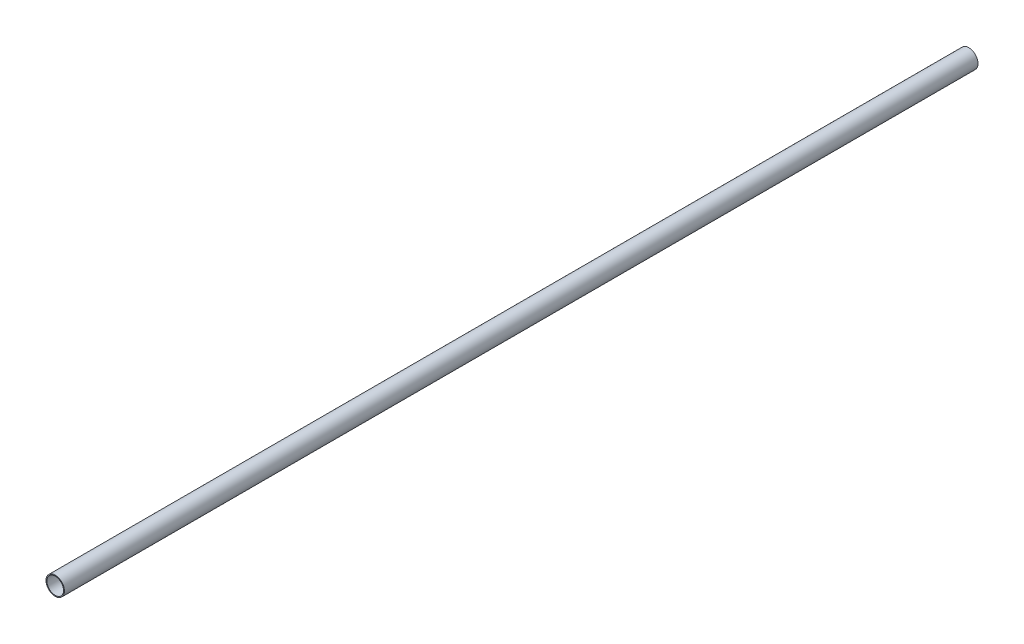
ISO-10303-21;
HEADER;
FILE_DESCRIPTION(('STEP AP214'),'2;1');
FILE_NAME('part.step','',(''),(''),'','','');
FILE_SCHEMA(('AUTOMOTIVE_DESIGN { 1 0 10303 214 1 1 1 1 }'));
ENDSEC;
DATA;
#1=APPLICATION_CONTEXT('core data for automotive mechanical design processes');
#2=APPLICATION_PROTOCOL_DEFINITION('international standard','automotive_design',2000,#1);
#3=PRODUCT_CONTEXT('',#1,'mechanical');
#4=PRODUCT('Part','Part','',(#3));
#5=PRODUCT_RELATED_PRODUCT_CATEGORY('part','',(#4));
#6=PRODUCT_DEFINITION_FORMATION('','',#4);
#7=PRODUCT_DEFINITION_CONTEXT('part definition',#1,'design');
#8=PRODUCT_DEFINITION('design','',#6,#7);
#9=PRODUCT_DEFINITION_SHAPE('','',#8);
#10=(LENGTH_UNIT() NAMED_UNIT(*) SI_UNIT(.MILLI.,.METRE.));
#11=(NAMED_UNIT(*) PLANE_ANGLE_UNIT() SI_UNIT($,.RADIAN.));
#12=(NAMED_UNIT(*) SI_UNIT($,.STERADIAN.) SOLID_ANGLE_UNIT());
#13=UNCERTAINTY_MEASURE_WITH_UNIT(LENGTH_MEASURE(1.E-05),#10,'distance_accuracy_value','');
#14=(GEOMETRIC_REPRESENTATION_CONTEXT(3) GLOBAL_UNCERTAINTY_ASSIGNED_CONTEXT((#13)) GLOBAL_UNIT_ASSIGNED_CONTEXT((#10,
#11,#12)) REPRESENTATION_CONTEXT('',''));
#15=CARTESIAN_POINT('',(0.,0.,0.));
#16=DIRECTION('',(0.,0.,1.));
#17=DIRECTION('',(1.,0.,0.));
#18=AXIS2_PLACEMENT_3D('',#15,#16,#17);
#19=CARTESIAN_POINT('',(0.,0.,1259.7003));
#20=DIRECTION('',(0.,0.,1.));
#21=DIRECTION('',(1.,0.,0.));
#22=AXIS2_PLACEMENT_3D('',#19,#20,#21);
#23=PLANE('',#22);
#24=CARTESIAN_POINT('',(0.,0.,1259.7003));
#25=DIRECTION('',(0.,0.,1.));
#26=DIRECTION('',(1.,0.,0.));
#27=AXIS2_PLACEMENT_3D('',#24,#25,#26);
#28=CIRCLE('',#27,25.4);
#29=CARTESIAN_POINT('',(-25.4,0.,1259.7003));
#30=VERTEX_POINT('',#29);
#31=EDGE_CURVE('E10',#30,#30,#28,.T.);
#32=ORIENTED_EDGE('',*,*,#31,.T.);
#33=EDGE_LOOP('',(#32));
#34=FACE_BOUND('',#33,.T.);
#35=CARTESIAN_POINT('',(0.,0.,1259.7003));
#36=DIRECTION('',(0.,0.,1.));
#37=DIRECTION('',(1.,0.,0.));
#38=AXIS2_PLACEMENT_3D('',#35,#36,#37);
#39=CIRCLE('',#38,22.987);
#40=CARTESIAN_POINT('',(-22.987,0.,1259.7003));
#41=VERTEX_POINT('',#40);
#42=EDGE_CURVE('E47',#41,#41,#39,.T.);
#43=ORIENTED_EDGE('',*,*,#42,.F.);
#44=EDGE_LOOP('',(#43));
#45=FACE_BOUND('',#44,.T.);
#46=ADVANCED_FACE('F36',(#34,#45),#23,.T.);
#47=CARTESIAN_POINT('',(0.,-1.11022302462516E-13,-1259.7003));
#48=DIRECTION('',(0.,0.,1.));
#49=DIRECTION('',(1.,0.,0.));
#50=AXIS2_PLACEMENT_3D('',#47,#48,#49);
#51=PLANE('',#50);
#52=CARTESIAN_POINT('',(0.,-1.11022302462516E-13,-1259.7003));
#53=DIRECTION('',(0.,0.,1.));
#54=DIRECTION('',(1.,0.,0.));
#55=AXIS2_PLACEMENT_3D('',#52,#53,#54);
#56=CIRCLE('',#55,25.4);
#57=CARTESIAN_POINT('',(-25.4,0.,-1259.7003));
#58=VERTEX_POINT('',#57);
#59=EDGE_CURVE('E43',#58,#58,#56,.T.);
#60=ORIENTED_EDGE('',*,*,#59,.F.);
#61=EDGE_LOOP('',(#60));
#62=FACE_BOUND('',#61,.T.);
#63=CARTESIAN_POINT('',(0.,-1.11022302462516E-13,-1259.7003));
#64=DIRECTION('',(0.,0.,1.));
#65=DIRECTION('',(1.,0.,0.));
#66=AXIS2_PLACEMENT_3D('',#63,#64,#65);
#67=CIRCLE('',#66,22.987);
#68=CARTESIAN_POINT('',(-22.987,0.,-1259.7003));
#69=VERTEX_POINT('',#68);
#70=EDGE_CURVE('E51',#69,#69,#67,.T.);
#71=ORIENTED_EDGE('',*,*,#70,.T.);
#72=EDGE_LOOP('',(#71));
#73=FACE_BOUND('',#72,.T.);
#74=ADVANCED_FACE('F57',(#62,#73),#51,.F.);
#75=CARTESIAN_POINT('',(0.,0.,1259.7003));
#76=DIRECTION('',(0.,0.,-1.));
#77=DIRECTION('',(-1.,0.,0.));
#78=AXIS2_PLACEMENT_3D('',#75,#76,#77);
#79=CYLINDRICAL_SURFACE('',#78,25.4);
#80=CARTESIAN_POINT('',(-25.4,0.,1259.7003));
#81=CARTESIAN_POINT('',(-25.4,0.,1233.45654375));
#82=CARTESIAN_POINT('',(-25.4,0.,1207.2127875));
#83=CARTESIAN_POINT('',(-25.4,0.,1154.725275));
#84=CARTESIAN_POINT('',(-25.4,0.,1128.48151875));
#85=CARTESIAN_POINT('',(-25.4,0.,1075.99400625));
#86=CARTESIAN_POINT('',(-25.4,0.,1049.75025));
#87=CARTESIAN_POINT('',(-25.4,0.,997.2627375));
#88=CARTESIAN_POINT('',(-25.4,0.,971.01898125));
#89=CARTESIAN_POINT('',(-25.4,0.,918.53146875));
#90=CARTESIAN_POINT('',(-25.4,0.,892.2877125));
#91=CARTESIAN_POINT('',(-25.4,0.,839.8002));
#92=CARTESIAN_POINT('',(-25.4,0.,813.55644375));
#93=CARTESIAN_POINT('',(-25.4,0.,761.06893125));
#94=CARTESIAN_POINT('',(-25.4,0.,734.825175));
#95=CARTESIAN_POINT('',(-25.4,0.,682.3376625));
#96=CARTESIAN_POINT('',(-25.4,0.,656.09390625));
#97=CARTESIAN_POINT('',(-25.4,0.,603.60639375));
#98=CARTESIAN_POINT('',(-25.4,0.,577.3626375));
#99=CARTESIAN_POINT('',(-25.4,0.,524.875125));
#100=CARTESIAN_POINT('',(-25.4,0.,498.63136875));
#101=CARTESIAN_POINT('',(-25.4,0.,446.14385625));
#102=CARTESIAN_POINT('',(-25.4,0.,419.9001));
#103=CARTESIAN_POINT('',(-25.4,0.,367.4125875));
#104=CARTESIAN_POINT('',(-25.4,0.,341.16883125));
#105=CARTESIAN_POINT('',(-25.4,0.,288.68131875));
#106=CARTESIAN_POINT('',(-25.4,0.,262.4375625));
#107=CARTESIAN_POINT('',(-25.4,0.,209.95005));
#108=CARTESIAN_POINT('',(-25.4,0.,183.70629375));
#109=CARTESIAN_POINT('',(-25.4,0.,131.21878125));
#110=CARTESIAN_POINT('',(-25.4,0.,104.975025));
#111=CARTESIAN_POINT('',(-25.4,0.,52.4875125000002));
#112=CARTESIAN_POINT('',(-25.4,0.,26.2437562500002));
#113=CARTESIAN_POINT('',(-25.4,0.,-26.2437562499997));
#114=CARTESIAN_POINT('',(-25.4,0.,-52.4875124999997));
#115=CARTESIAN_POINT('',(-25.4,0.,-104.975025));
#116=CARTESIAN_POINT('',(-25.4,0.,-131.21878125));
#117=CARTESIAN_POINT('',(-25.4,0.,-183.70629375));
#118=CARTESIAN_POINT('',(-25.4,0.,-209.95005));
#119=CARTESIAN_POINT('',(-25.4,0.,-262.4375625));
#120=CARTESIAN_POINT('',(-25.4,0.,-288.68131875));
#121=CARTESIAN_POINT('',(-25.4,0.,-341.168831249999));
#122=CARTESIAN_POINT('',(-25.4,0.,-367.412587499999));
#123=CARTESIAN_POINT('',(-25.4,0.,-419.900099999999));
#124=CARTESIAN_POINT('',(-25.4,0.,-446.143856249999));
#125=CARTESIAN_POINT('',(-25.4,0.,-498.631368749999));
#126=CARTESIAN_POINT('',(-25.4,0.,-524.875124999999));
#127=CARTESIAN_POINT('',(-25.4,0.,-577.362637499999));
#128=CARTESIAN_POINT('',(-25.4,0.,-603.606393749999));
#129=CARTESIAN_POINT('',(-25.4,0.,-656.093906249999));
#130=CARTESIAN_POINT('',(-25.4,0.,-682.337662499999));
#131=CARTESIAN_POINT('',(-25.4,0.,-734.825174999999));
#132=CARTESIAN_POINT('',(-25.4,0.,-761.068931249999));
#133=CARTESIAN_POINT('',(-25.4,0.,-813.556443749999));
#134=CARTESIAN_POINT('',(-25.4,0.,-839.800199999999));
#135=CARTESIAN_POINT('',(-25.4,0.,-892.287712499999));
#136=CARTESIAN_POINT('',(-25.4,0.,-918.531468749999));
#137=CARTESIAN_POINT('',(-25.4,0.,-971.018981249999));
#138=CARTESIAN_POINT('',(-25.4,0.,-997.262737499999));
#139=CARTESIAN_POINT('',(-25.4,0.,-1049.75025));
#140=CARTESIAN_POINT('',(-25.4,0.,-1075.99400625));
#141=CARTESIAN_POINT('',(-25.4,0.,-1128.48151875));
#142=CARTESIAN_POINT('',(-25.4,0.,-1154.725275));
#143=CARTESIAN_POINT('',(-25.4,0.,-1207.2127875));
#144=CARTESIAN_POINT('',(-25.4,0.,-1233.45654375));
#145=CARTESIAN_POINT('',(-25.4,0.,-1259.7003));
#146=B_SPLINE_CURVE_WITH_KNOTS('',3,(#80,#81,#82,#83,#84,#85,#86,#87,#88,#89,#90,#91,#92,#93,
#94,#95,#96,#97,#98,#99,#100,#101,#102,#103,#104,#105,#106,#107,#108,#109,#110,#111,#112,#113,
#114,#115,#116,#117,#118,#119,#120,#121,#122,#123,#124,#125,#126,#127,#128,#129,#130,#131,#132,
#133,#134,#135,#136,#137,#138,#139,#140,#141,#142,#143,#144,#145),.UNSPECIFIED.,.F.,.F.,(4,2,2,
2,2,2,2,2,2,2,2,2,2,2,2,2,2,2,2,2,2,2,2,2,2,2,2,2,2,2,2,2,4),(0.,78.7312687499999,157.4625375,
236.19380625,314.925075,393.65634375,472.3876125,551.11888125,629.85015,708.581418749999,
787.312687499999,866.043956249999,944.775224999999,1023.50649375,1102.2377625,1180.96903125,
1259.7003,1338.43156875,1417.1628375,1495.89410625,1574.625375,1653.35664375,1732.0879125,
1810.81918125,1889.55045,1968.28171875,2047.0129875,2125.74425625,2204.475525,2283.20679375,
2361.9380625,2440.66933125,2519.4006),.UNSPECIFIED.);
#147=EDGE_CURVE('BSEAM38',#30,#58,#146,.T.);
#148=ORIENTED_EDGE('',*,*,#31,.F.);
#149=ORIENTED_EDGE('',*,*,#59,.T.);
#150=ORIENTED_EDGE('',*,*,#147,.T.);
#151=ORIENTED_EDGE('',*,*,#147,.F.);
#152=EDGE_LOOP('',(#148,#150,#149,#151));
#153=FACE_BOUND('',#152,.T.);
#154=ADVANCED_FACE('F38',(#153),#79,.T.);
#155=CARTESIAN_POINT('',(0.,0.,1259.7003));
#156=DIRECTION('',(0.,0.,-1.));
#157=DIRECTION('',(-1.,0.,0.));
#158=AXIS2_PLACEMENT_3D('',#155,#156,#157);
#159=CYLINDRICAL_SURFACE('',#158,22.987);
#160=CARTESIAN_POINT('',(-22.987,0.,1259.7003));
#161=CARTESIAN_POINT('',(-22.987,0.,1233.45654375));
#162=CARTESIAN_POINT('',(-22.987,0.,1207.2127875));
#163=CARTESIAN_POINT('',(-22.987,0.,1154.725275));
#164=CARTESIAN_POINT('',(-22.987,0.,1128.48151875));
#165=CARTESIAN_POINT('',(-22.987,0.,1075.99400625));
#166=CARTESIAN_POINT('',(-22.987,0.,1049.75025));
#167=CARTESIAN_POINT('',(-22.987,0.,997.2627375));
#168=CARTESIAN_POINT('',(-22.987,0.,971.01898125));
#169=CARTESIAN_POINT('',(-22.987,0.,918.53146875));
#170=CARTESIAN_POINT('',(-22.987,0.,892.2877125));
#171=CARTESIAN_POINT('',(-22.987,0.,839.8002));
#172=CARTESIAN_POINT('',(-22.987,0.,813.55644375));
#173=CARTESIAN_POINT('',(-22.987,0.,761.06893125));
#174=CARTESIAN_POINT('',(-22.987,0.,734.825175));
#175=CARTESIAN_POINT('',(-22.987,0.,682.3376625));
#176=CARTESIAN_POINT('',(-22.987,0.,656.09390625));
#177=CARTESIAN_POINT('',(-22.987,0.,603.60639375));
#178=CARTESIAN_POINT('',(-22.987,0.,577.3626375));
#179=CARTESIAN_POINT('',(-22.987,0.,524.875125));
#180=CARTESIAN_POINT('',(-22.987,0.,498.63136875));
#181=CARTESIAN_POINT('',(-22.987,0.,446.14385625));
#182=CARTESIAN_POINT('',(-22.987,0.,419.9001));
#183=CARTESIAN_POINT('',(-22.987,0.,367.4125875));
#184=CARTESIAN_POINT('',(-22.987,0.,341.16883125));
#185=CARTESIAN_POINT('',(-22.987,0.,288.68131875));
#186=CARTESIAN_POINT('',(-22.987,0.,262.4375625));
#187=CARTESIAN_POINT('',(-22.987,0.,209.95005));
#188=CARTESIAN_POINT('',(-22.987,0.,183.70629375));
#189=CARTESIAN_POINT('',(-22.987,0.,131.21878125));
#190=CARTESIAN_POINT('',(-22.987,0.,104.975025));
#191=CARTESIAN_POINT('',(-22.987,0.,52.4875125000002));
#192=CARTESIAN_POINT('',(-22.987,0.,26.2437562500002));
#193=CARTESIAN_POINT('',(-22.987,0.,-26.2437562499997));
#194=CARTESIAN_POINT('',(-22.987,0.,-52.4875124999997));
#195=CARTESIAN_POINT('',(-22.987,0.,-104.975025));
#196=CARTESIAN_POINT('',(-22.987,0.,-131.21878125));
#197=CARTESIAN_POINT('',(-22.987,0.,-183.70629375));
#198=CARTESIAN_POINT('',(-22.987,0.,-209.95005));
#199=CARTESIAN_POINT('',(-22.987,0.,-262.4375625));
#200=CARTESIAN_POINT('',(-22.987,0.,-288.68131875));
#201=CARTESIAN_POINT('',(-22.987,0.,-341.168831249999));
#202=CARTESIAN_POINT('',(-22.987,0.,-367.412587499999));
#203=CARTESIAN_POINT('',(-22.987,0.,-419.900099999999));
#204=CARTESIAN_POINT('',(-22.987,0.,-446.143856249999));
#205=CARTESIAN_POINT('',(-22.987,0.,-498.631368749999));
#206=CARTESIAN_POINT('',(-22.987,0.,-524.875124999999));
#207=CARTESIAN_POINT('',(-22.987,0.,-577.362637499999));
#208=CARTESIAN_POINT('',(-22.987,0.,-603.606393749999));
#209=CARTESIAN_POINT('',(-22.987,0.,-656.093906249999));
#210=CARTESIAN_POINT('',(-22.987,0.,-682.337662499999));
#211=CARTESIAN_POINT('',(-22.987,0.,-734.825174999999));
#212=CARTESIAN_POINT('',(-22.987,0.,-761.068931249999));
#213=CARTESIAN_POINT('',(-22.987,0.,-813.556443749999));
#214=CARTESIAN_POINT('',(-22.987,0.,-839.800199999999));
#215=CARTESIAN_POINT('',(-22.987,0.,-892.287712499999));
#216=CARTESIAN_POINT('',(-22.987,0.,-918.531468749999));
#217=CARTESIAN_POINT('',(-22.987,0.,-971.018981249999));
#218=CARTESIAN_POINT('',(-22.987,0.,-997.262737499999));
#219=CARTESIAN_POINT('',(-22.987,0.,-1049.75025));
#220=CARTESIAN_POINT('',(-22.987,0.,-1075.99400625));
#221=CARTESIAN_POINT('',(-22.987,0.,-1128.48151875));
#222=CARTESIAN_POINT('',(-22.987,0.,-1154.725275));
#223=CARTESIAN_POINT('',(-22.987,0.,-1207.2127875));
#224=CARTESIAN_POINT('',(-22.987,0.,-1233.45654375));
#225=CARTESIAN_POINT('',(-22.987,0.,-1259.7003));
#226=B_SPLINE_CURVE_WITH_KNOTS('',3,(#160,#161,#162,#163,#164,#165,#166,#167,#168,#169,#170,
#171,#172,#173,#174,#175,#176,#177,#178,#179,#180,#181,#182,#183,#184,#185,#186,#187,#188,#189,
#190,#191,#192,#193,#194,#195,#196,#197,#198,#199,#200,#201,#202,#203,#204,#205,#206,#207,#208,
#209,#210,#211,#212,#213,#214,#215,#216,#217,#218,#219,#220,#221,#222,#223,#224,#225),
.UNSPECIFIED.,.F.,.F.,(4,2,2,2,2,2,2,2,2,2,2,2,2,2,2,2,2,2,2,2,2,2,2,2,2,2,2,2,2,2,2,2,4),(0.,
78.7312687499999,157.4625375,236.19380625,314.925075,393.65634375,472.3876125,551.11888125,
629.85015,708.581418749999,787.312687499999,866.043956249999,944.775224999999,1023.50649375,
1102.2377625,1180.96903125,1259.7003,1338.43156875,1417.1628375,1495.89410625,1574.625375,
1653.35664375,1732.0879125,1810.81918125,1889.55045,1968.28171875,2047.0129875,2125.74425625,
2204.475525,2283.20679375,2361.9380625,2440.66933125,2519.4006),.UNSPECIFIED.);
#227=EDGE_CURVE('BSEAM59',#41,#69,#226,.T.);
#228=ORIENTED_EDGE('',*,*,#42,.T.);
#229=ORIENTED_EDGE('',*,*,#70,.F.);
#230=ORIENTED_EDGE('',*,*,#227,.T.);
#231=ORIENTED_EDGE('',*,*,#227,.F.);
#232=EDGE_LOOP('',(#228,#230,#229,#231));
#233=FACE_BOUND('',#232,.T.);
#234=ADVANCED_FACE('F59',(#233),#159,.F.);
#235=CLOSED_SHELL('',(#46,#74,#154,#234));
#236=MANIFOLD_SOLID_BREP('B2',#235);
#237=ADVANCED_BREP_SHAPE_REPRESENTATION('',(#18,#236),#14);
#238=SHAPE_DEFINITION_REPRESENTATION(#9,#237);
ENDSEC;
END-ISO-10303-21;
